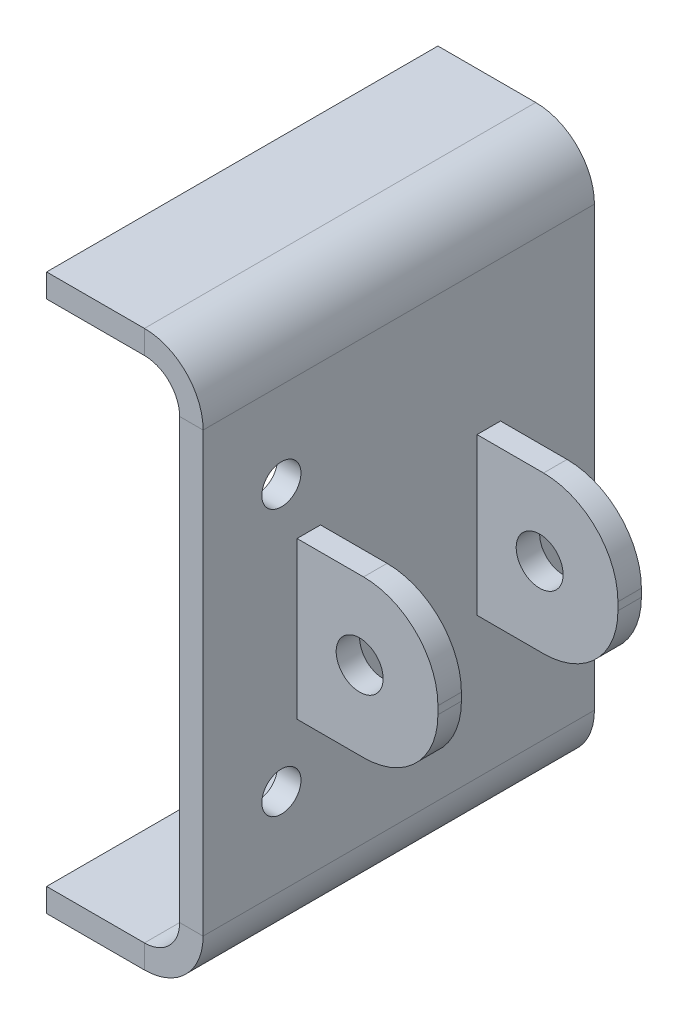
ISO-10303-21;
HEADER;
FILE_DESCRIPTION(('STEP AP214'),'2;1');
FILE_NAME('part.step','',(''),(''),'','','');
FILE_SCHEMA(('AUTOMOTIVE_DESIGN { 1 0 10303 214 1 1 1 1 }'));
ENDSEC;
DATA;
#1=APPLICATION_CONTEXT('core data for automotive mechanical design processes');
#2=APPLICATION_PROTOCOL_DEFINITION('international standard','automotive_design',2000,#1);
#3=PRODUCT_CONTEXT('',#1,'mechanical');
#4=PRODUCT('Part','Part','',(#3));
#5=PRODUCT_RELATED_PRODUCT_CATEGORY('part','',(#4));
#6=PRODUCT_DEFINITION_FORMATION('','',#4);
#7=PRODUCT_DEFINITION_CONTEXT('part definition',#1,'design');
#8=PRODUCT_DEFINITION('design','',#6,#7);
#9=PRODUCT_DEFINITION_SHAPE('','',#8);
#10=(LENGTH_UNIT() NAMED_UNIT(*) SI_UNIT(.MILLI.,.METRE.));
#11=(NAMED_UNIT(*) PLANE_ANGLE_UNIT() SI_UNIT($,.RADIAN.));
#12=(NAMED_UNIT(*) SI_UNIT($,.STERADIAN.) SOLID_ANGLE_UNIT());
#13=UNCERTAINTY_MEASURE_WITH_UNIT(LENGTH_MEASURE(1.E-05),#10,'distance_accuracy_value','');
#14=(GEOMETRIC_REPRESENTATION_CONTEXT(3) GLOBAL_UNCERTAINTY_ASSIGNED_CONTEXT((#13)) GLOBAL_UNIT_ASSIGNED_CONTEXT((#10,
#11,#12)) REPRESENTATION_CONTEXT('',''));
#15=CARTESIAN_POINT('',(0.,0.,0.));
#16=DIRECTION('',(0.,0.,1.));
#17=DIRECTION('',(1.,0.,0.));
#18=AXIS2_PLACEMENT_3D('',#15,#16,#17);
#19=CARTESIAN_POINT('',(3.,0.,0.));
#20=DIRECTION('',(-1.,0.,0.));
#21=DIRECTION('',(0.,0.,1.));
#22=AXIS2_PLACEMENT_3D('',#19,#20,#21);
#23=PLANE('',#22);
#24=DIRECTION('',(0.,0.,-1.));
#25=VECTOR('',#24,1.);
#26=CARTESIAN_POINT('',(3.,-10.,-10.));
#27=LINE('',#26,#25);
#28=CARTESIAN_POINT('',(3.,-10.,-10.));
#29=VERTEX_POINT('',#28);
#30=CARTESIAN_POINT('',(3.,-10.,-13.));
#31=VERTEX_POINT('',#30);
#32=EDGE_CURVE('E219',#29,#31,#27,.T.);
#33=ORIENTED_EDGE('',*,*,#32,.F.);
#34=DIRECTION('',(0.,-1.,0.));
#35=VECTOR('',#34,1.);
#36=CARTESIAN_POINT('',(3.,9.99999999999999,-10.));
#37=LINE('',#36,#35);
#38=CARTESIAN_POINT('',(3.,9.99999999999999,-10.));
#39=VERTEX_POINT('',#38);
#40=EDGE_CURVE('E246',#39,#29,#37,.T.);
#41=ORIENTED_EDGE('',*,*,#40,.F.);
#42=DIRECTION('',(0.,0.,1.));
#43=VECTOR('',#42,1.);
#44=CARTESIAN_POINT('',(3.,9.99999999999999,-10.));
#45=LINE('',#44,#43);
#46=CARTESIAN_POINT('',(3.,9.99999999999999,-13.));
#47=VERTEX_POINT('',#46);
#48=EDGE_CURVE('E249',#47,#39,#45,.T.);
#49=ORIENTED_EDGE('',*,*,#48,.F.);
#50=DIRECTION('',(0.,1.,0.));
#51=VECTOR('',#50,1.);
#52=CARTESIAN_POINT('',(3.,9.99999999999999,-13.));
#53=LINE('',#52,#51);
#54=EDGE_CURVE('E253',#31,#47,#53,.T.);
#55=ORIENTED_EDGE('',*,*,#54,.F.);
#56=EDGE_LOOP('',(#33,#41,#49,#55));
#57=FACE_BOUND('',#56,.T.);
#58=CARTESIAN_POINT('',(3.,-17.,15.));
#59=DIRECTION('',(1.,0.,0.));
#60=DIRECTION('',(0.,0.,-1.));
#61=AXIS2_PLACEMENT_3D('',#58,#59,#60);
#62=CIRCLE('',#61,2.5);
#63=CARTESIAN_POINT('',(3.,-17.,12.5));
#64=VERTEX_POINT('',#63);
#65=EDGE_CURVE('E262',#64,#64,#62,.T.);
#66=ORIENTED_EDGE('',*,*,#65,.F.);
#67=EDGE_LOOP('',(#66));
#68=FACE_BOUND('',#67,.T.);
#69=CARTESIAN_POINT('',(3.,17.,15.));
#70=DIRECTION('',(1.,0.,0.));
#71=DIRECTION('',(0.,0.,-1.));
#72=AXIS2_PLACEMENT_3D('',#69,#70,#71);
#73=CIRCLE('',#72,2.5);
#74=CARTESIAN_POINT('',(3.,17.,12.5));
#75=VERTEX_POINT('',#74);
#76=EDGE_CURVE('E235',#75,#75,#73,.T.);
#77=ORIENTED_EDGE('',*,*,#76,.F.);
#78=EDGE_LOOP('',(#77));
#79=FACE_BOUND('',#78,.T.);
#80=DIRECTION('',(0.,0.,1.));
#81=VECTOR('',#80,1.);
#82=CARTESIAN_POINT('',(3.,-28.,25.));
#83=LINE('',#82,#81);
#84=CARTESIAN_POINT('',(3.,-28.,25.));
#85=VERTEX_POINT('',#84);
#86=CARTESIAN_POINT('',(3.,-28.,-25.));
#87=VERTEX_POINT('',#86);
#88=EDGE_CURVE('E300',#85,#87,#83,.F.);
#89=ORIENTED_EDGE('',*,*,#88,.T.);
#90=DIRECTION('',(0.,1.,0.));
#91=VECTOR('',#90,1.);
#92=CARTESIAN_POINT('',(3.,-32.5,-25.));
#93=LINE('',#92,#91);
#94=CARTESIAN_POINT('',(3.,28.,-25.));
#95=VERTEX_POINT('',#94);
#96=EDGE_CURVE('E377',#87,#95,#93,.T.);
#97=ORIENTED_EDGE('',*,*,#96,.T.);
#98=DIRECTION('',(0.,0.,-1.));
#99=VECTOR('',#98,1.);
#100=CARTESIAN_POINT('',(3.,28.,-25.));
#101=LINE('',#100,#99);
#102=CARTESIAN_POINT('',(3.,28.,25.));
#103=VERTEX_POINT('',#102);
#104=EDGE_CURVE('E353',#95,#103,#101,.F.);
#105=ORIENTED_EDGE('',*,*,#104,.T.);
#106=DIRECTION('',(0.,-1.,0.));
#107=VECTOR('',#106,1.);
#108=CARTESIAN_POINT('',(3.,-32.5,25.));
#109=LINE('',#108,#107);
#110=EDGE_CURVE('E375',#103,#85,#109,.T.);
#111=ORIENTED_EDGE('',*,*,#110,.T.);
#112=EDGE_LOOP('',(#89,#97,#105,#111));
#113=FACE_BOUND('',#112,.T.);
#114=DIRECTION('',(0.,0.,-1.));
#115=VECTOR('',#114,1.);
#116=CARTESIAN_POINT('',(3.,-10.,13.));
#117=LINE('',#116,#115);
#118=CARTESIAN_POINT('',(3.,-10.,13.));
#119=VERTEX_POINT('',#118);
#120=CARTESIAN_POINT('',(3.,-10.,10.));
#121=VERTEX_POINT('',#120);
#122=EDGE_CURVE('E205',#119,#121,#117,.T.);
#123=ORIENTED_EDGE('',*,*,#122,.F.);
#124=DIRECTION('',(0.,-1.,0.));
#125=VECTOR('',#124,1.);
#126=CARTESIAN_POINT('',(3.,9.99999999999999,13.));
#127=LINE('',#126,#125);
#128=CARTESIAN_POINT('',(3.,9.99999999999999,13.));
#129=VERTEX_POINT('',#128);
#130=EDGE_CURVE('E215',#129,#119,#127,.T.);
#131=ORIENTED_EDGE('',*,*,#130,.F.);
#132=DIRECTION('',(0.,0.,1.));
#133=VECTOR('',#132,1.);
#134=CARTESIAN_POINT('',(3.,9.99999999999999,13.));
#135=LINE('',#134,#133);
#136=CARTESIAN_POINT('',(3.,9.99999999999999,10.));
#137=VERTEX_POINT('',#136);
#138=EDGE_CURVE('E223',#137,#129,#135,.T.);
#139=ORIENTED_EDGE('',*,*,#138,.F.);
#140=DIRECTION('',(0.,1.,0.));
#141=VECTOR('',#140,1.);
#142=CARTESIAN_POINT('',(3.,9.99999999999999,10.));
#143=LINE('',#142,#141);
#144=EDGE_CURVE('E218',#121,#137,#143,.T.);
#145=ORIENTED_EDGE('',*,*,#144,.F.);
#146=EDGE_LOOP('',(#123,#131,#139,#145));
#147=FACE_BOUND('',#146,.T.);
#148=ADVANCED_FACE('F43',(#57,#68,#79,#113,#147),#23,.F.);
#149=CARTESIAN_POINT('',(3.,-32.5,25.));
#150=DIRECTION('',(0.,0.,-1.));
#151=DIRECTION('',(-1.,0.,0.));
#152=AXIS2_PLACEMENT_3D('',#149,#150,#151);
#153=PLANE('',#152);
#154=DIRECTION('',(1.,0.,0.));
#155=VECTOR('',#154,1.);
#156=CARTESIAN_POINT('',(0.,-28.,25.));
#157=LINE('',#156,#155);
#158=CARTESIAN_POINT('',(0.,-28.,25.));
#159=VERTEX_POINT('',#158);
#160=EDGE_CURVE('E306',#159,#85,#157,.T.);
#161=ORIENTED_EDGE('',*,*,#160,.T.);
#162=ORIENTED_EDGE('',*,*,#110,.F.);
#163=DIRECTION('',(1.,0.,0.));
#164=VECTOR('',#163,1.);
#165=CARTESIAN_POINT('',(0.,28.,25.));
#166=LINE('',#165,#164);
#167=CARTESIAN_POINT('',(0.,28.,25.));
#168=VERTEX_POINT('',#167);
#169=EDGE_CURVE('E370',#168,#103,#166,.T.);
#170=ORIENTED_EDGE('',*,*,#169,.F.);
#171=DIRECTION('',(0.,-1.,0.));
#172=VECTOR('',#171,1.);
#173=CARTESIAN_POINT('',(0.,-32.5,25.));
#174=LINE('',#173,#172);
#175=EDGE_CURVE('E373',#168,#159,#174,.T.);
#176=ORIENTED_EDGE('',*,*,#175,.T.);
#177=EDGE_LOOP('',(#161,#162,#170,#176));
#178=FACE_BOUND('',#177,.T.);
#179=ADVANCED_FACE('F462',(#178),#153,.F.);
#180=CARTESIAN_POINT('',(3.,-32.5,-25.));
#181=DIRECTION('',(0.,0.,1.));
#182=DIRECTION('',(1.,0.,0.));
#183=AXIS2_PLACEMENT_3D('',#180,#181,#182);
#184=PLANE('',#183);
#185=DIRECTION('',(1.,0.,0.));
#186=VECTOR('',#185,1.);
#187=CARTESIAN_POINT('',(0.,-28.,-25.));
#188=LINE('',#187,#186);
#189=CARTESIAN_POINT('',(0.,-28.,-25.));
#190=VERTEX_POINT('',#189);
#191=EDGE_CURVE('E317',#190,#87,#188,.T.);
#192=ORIENTED_EDGE('',*,*,#191,.F.);
#193=DIRECTION('',(0.,1.,0.));
#194=VECTOR('',#193,1.);
#195=CARTESIAN_POINT('',(0.,-32.5,-25.));
#196=LINE('',#195,#194);
#197=CARTESIAN_POINT('',(0.,28.,-25.));
#198=VERTEX_POINT('',#197);
#199=EDGE_CURVE('E378',#190,#198,#196,.T.);
#200=ORIENTED_EDGE('',*,*,#199,.T.);
#201=DIRECTION('',(1.,0.,0.));
#202=VECTOR('',#201,1.);
#203=CARTESIAN_POINT('',(0.,28.,-25.));
#204=LINE('',#203,#202);
#205=EDGE_CURVE('E359',#198,#95,#204,.T.);
#206=ORIENTED_EDGE('',*,*,#205,.T.);
#207=ORIENTED_EDGE('',*,*,#96,.F.);
#208=EDGE_LOOP('',(#192,#200,#206,#207));
#209=FACE_BOUND('',#208,.T.);
#210=ADVANCED_FACE('F470',(#209),#184,.F.);
#211=CARTESIAN_POINT('',(0.,0.,0.));
#212=DIRECTION('',(-1.,0.,0.));
#213=DIRECTION('',(0.,0.,1.));
#214=AXIS2_PLACEMENT_3D('',#211,#212,#213);
#215=PLANE('',#214);
#216=CARTESIAN_POINT('',(0.,-17.,15.));
#217=DIRECTION('',(-1.,0.,0.));
#218=DIRECTION('',(0.,0.,1.));
#219=AXIS2_PLACEMENT_3D('',#216,#217,#218);
#220=CIRCLE('',#219,2.5);
#221=CARTESIAN_POINT('',(0.,-17.,17.5));
#222=VERTEX_POINT('',#221);
#223=EDGE_CURVE('E277',#222,#222,#220,.T.);
#224=ORIENTED_EDGE('',*,*,#223,.F.);
#225=EDGE_LOOP('',(#224));
#226=FACE_BOUND('',#225,.T.);
#227=CARTESIAN_POINT('',(0.,17.,15.));
#228=DIRECTION('',(-1.,0.,0.));
#229=DIRECTION('',(0.,0.,1.));
#230=AXIS2_PLACEMENT_3D('',#227,#228,#229);
#231=CIRCLE('',#230,2.5);
#232=CARTESIAN_POINT('',(0.,17.,17.5));
#233=VERTEX_POINT('',#232);
#234=EDGE_CURVE('E265',#233,#233,#231,.T.);
#235=ORIENTED_EDGE('',*,*,#234,.F.);
#236=EDGE_LOOP('',(#235));
#237=FACE_BOUND('',#236,.T.);
#238=ORIENTED_EDGE('',*,*,#199,.F.);
#239=DIRECTION('',(0.,0.,1.));
#240=VECTOR('',#239,1.);
#241=CARTESIAN_POINT('',(0.,-28.,25.));
#242=LINE('',#241,#240);
#243=EDGE_CURVE('E312',#159,#190,#242,.F.);
#244=ORIENTED_EDGE('',*,*,#243,.F.);
#245=ORIENTED_EDGE('',*,*,#175,.F.);
#246=DIRECTION('',(0.,0.,-1.));
#247=VECTOR('',#246,1.);
#248=CARTESIAN_POINT('',(0.,28.,-25.));
#249=LINE('',#248,#247);
#250=EDGE_CURVE('E365',#198,#168,#249,.F.);
#251=ORIENTED_EDGE('',*,*,#250,.F.);
#252=EDGE_LOOP('',(#238,#244,#245,#251));
#253=FACE_BOUND('',#252,.T.);
#254=ADVANCED_FACE('F479',(#226,#237,#253),#215,.T.);
#255=CARTESIAN_POINT('',(-4.5,28.,25.));
#256=DIRECTION('',(0.,0.,1.));
#257=DIRECTION('',(1.,0.,0.));
#258=AXIS2_PLACEMENT_3D('',#255,#256,#257);
#259=PLANE('',#258);
#260=DIRECTION('',(0.,1.,0.));
#261=VECTOR('',#260,1.);
#262=CARTESIAN_POINT('',(-4.49999999999998,32.5,25.));
#263=LINE('',#262,#261);
#264=CARTESIAN_POINT('',(-4.49999999999998,32.5,25.));
#265=VERTEX_POINT('',#264);
#266=CARTESIAN_POINT('',(-4.49999999999997,35.5,25.));
#267=VERTEX_POINT('',#266);
#268=EDGE_CURVE('E320',#265,#267,#263,.T.);
#269=ORIENTED_EDGE('',*,*,#268,.F.);
#270=CARTESIAN_POINT('',(-4.5,28.,25.));
#271=DIRECTION('',(0.,0.,-1.));
#272=DIRECTION('',(-1.,0.,0.));
#273=AXIS2_PLACEMENT_3D('',#270,#271,#272);
#274=CIRCLE('',#273,4.5);
#275=EDGE_CURVE('E362',#168,#265,#274,.F.);
#276=ORIENTED_EDGE('',*,*,#275,.F.);
#277=ORIENTED_EDGE('',*,*,#169,.T.);
#278=CARTESIAN_POINT('',(-4.5,28.,25.));
#279=DIRECTION('',(0.,0.,-1.));
#280=DIRECTION('',(-1.,0.,0.));
#281=AXIS2_PLACEMENT_3D('',#278,#279,#280);
#282=CIRCLE('',#281,7.5);
#283=EDGE_CURVE('E355',#103,#267,#282,.F.);
#284=ORIENTED_EDGE('',*,*,#283,.T.);
#285=EDGE_LOOP('',(#269,#276,#277,#284));
#286=FACE_BOUND('',#285,.T.);
#287=ADVANCED_FACE('F482',(#286),#259,.T.);
#288=CARTESIAN_POINT('',(-4.5,28.,-25.));
#289=DIRECTION('',(0.,0.,1.));
#290=DIRECTION('',(1.,0.,0.));
#291=AXIS2_PLACEMENT_3D('',#288,#289,#290);
#292=PLANE('',#291);
#293=CARTESIAN_POINT('',(-4.5,28.,-25.));
#294=DIRECTION('',(0.,0.,-1.));
#295=DIRECTION('',(-1.,0.,0.));
#296=AXIS2_PLACEMENT_3D('',#293,#294,#295);
#297=CIRCLE('',#296,4.5);
#298=CARTESIAN_POINT('',(-4.49999999999998,32.5,-25.));
#299=VERTEX_POINT('',#298);
#300=EDGE_CURVE('E352',#299,#198,#297,.T.);
#301=ORIENTED_EDGE('',*,*,#300,.F.);
#302=DIRECTION('',(0.,1.,0.));
#303=VECTOR('',#302,1.);
#304=CARTESIAN_POINT('',(-4.49999999999998,32.5,-25.));
#305=LINE('',#304,#303);
#306=CARTESIAN_POINT('',(-4.49999999999997,35.5,-25.));
#307=VERTEX_POINT('',#306);
#308=EDGE_CURVE('E325',#299,#307,#305,.T.);
#309=ORIENTED_EDGE('',*,*,#308,.T.);
#310=CARTESIAN_POINT('',(-4.5,28.,-25.));
#311=DIRECTION('',(0.,0.,-1.));
#312=DIRECTION('',(-1.,0.,0.));
#313=AXIS2_PLACEMENT_3D('',#310,#311,#312);
#314=CIRCLE('',#313,7.5);
#315=EDGE_CURVE('E356',#307,#95,#314,.T.);
#316=ORIENTED_EDGE('',*,*,#315,.T.);
#317=ORIENTED_EDGE('',*,*,#205,.F.);
#318=EDGE_LOOP('',(#301,#309,#316,#317));
#319=FACE_BOUND('',#318,.T.);
#320=ADVANCED_FACE('F477',(#319),#292,.F.);
#321=CARTESIAN_POINT('',(-4.5,28.,-25.));
#322=DIRECTION('',(0.,0.,-1.));
#323=DIRECTION('',(0.,1.,0.));
#324=AXIS2_PLACEMENT_3D('',#321,#322,#323);
#325=CYLINDRICAL_SURFACE('',#324,7.5);
#326=ORIENTED_EDGE('',*,*,#104,.F.);
#327=ORIENTED_EDGE('',*,*,#315,.F.);
#328=DIRECTION('',(0.,0.,1.));
#329=VECTOR('',#328,1.);
#330=CARTESIAN_POINT('',(-4.49999999999997,35.5,0.));
#331=LINE('',#330,#329);
#332=EDGE_CURVE('E328',#307,#267,#331,.T.);
#333=ORIENTED_EDGE('',*,*,#332,.T.);
#334=ORIENTED_EDGE('',*,*,#283,.F.);
#335=EDGE_LOOP('',(#326,#327,#333,#334));
#336=FACE_BOUND('',#335,.T.);
#337=ADVANCED_FACE('F613',(#336),#325,.T.);
#338=CARTESIAN_POINT('',(-4.5,28.,-25.));
#339=DIRECTION('',(0.,0.,-1.));
#340=DIRECTION('',(0.,1.,0.));
#341=AXIS2_PLACEMENT_3D('',#338,#339,#340);
#342=CYLINDRICAL_SURFACE('',#341,4.5);
#343=ORIENTED_EDGE('',*,*,#250,.T.);
#344=ORIENTED_EDGE('',*,*,#275,.T.);
#345=DIRECTION('',(0.,0.,-1.));
#346=VECTOR('',#345,1.);
#347=CARTESIAN_POINT('',(-4.49999999999998,32.5,25.));
#348=LINE('',#347,#346);
#349=EDGE_CURVE('E323',#265,#299,#348,.T.);
#350=ORIENTED_EDGE('',*,*,#349,.T.);
#351=ORIENTED_EDGE('',*,*,#300,.T.);
#352=EDGE_LOOP('',(#343,#344,#350,#351));
#353=FACE_BOUND('',#352,.T.);
#354=ADVANCED_FACE('F611',(#353),#342,.F.);
#355=CARTESIAN_POINT('',(-17.,35.5000000000001,-25.));
#356=DIRECTION('',(0.,0.,1.));
#357=DIRECTION('',(1.,0.,0.));
#358=AXIS2_PLACEMENT_3D('',#355,#356,#357);
#359=PLANE('',#358);
#360=ORIENTED_EDGE('',*,*,#308,.F.);
#361=DIRECTION('',(-1.,0.,0.));
#362=VECTOR('',#361,1.);
#363=CARTESIAN_POINT('',(-17.,32.5000000000001,-25.));
#364=LINE('',#363,#362);
#365=CARTESIAN_POINT('',(-17.,32.5000000000001,-25.));
#366=VERTEX_POINT('',#365);
#367=EDGE_CURVE('E332',#299,#366,#364,.T.);
#368=ORIENTED_EDGE('',*,*,#367,.T.);
#369=DIRECTION('',(0.,-1.,0.));
#370=VECTOR('',#369,1.);
#371=CARTESIAN_POINT('',(-17.,35.5000000000001,-25.));
#372=LINE('',#371,#370);
#373=CARTESIAN_POINT('',(-17.,35.5000000000001,-25.));
#374=VERTEX_POINT('',#373);
#375=EDGE_CURVE('E349',#374,#366,#372,.T.);
#376=ORIENTED_EDGE('',*,*,#375,.F.);
#377=DIRECTION('',(-1.,0.,0.));
#378=VECTOR('',#377,1.);
#379=CARTESIAN_POINT('',(-17.,35.5000000000001,-25.));
#380=LINE('',#379,#378);
#381=EDGE_CURVE('E333',#307,#374,#380,.T.);
#382=ORIENTED_EDGE('',*,*,#381,.F.);
#383=EDGE_LOOP('',(#360,#368,#376,#382));
#384=FACE_BOUND('',#383,.T.);
#385=ADVANCED_FACE('F604',(#384),#359,.F.);
#386=CARTESIAN_POINT('',(0.,35.5,25.));
#387=DIRECTION('',(0.,0.,-1.));
#388=DIRECTION('',(-1.,0.,0.));
#389=AXIS2_PLACEMENT_3D('',#386,#387,#388);
#390=PLANE('',#389);
#391=ORIENTED_EDGE('',*,*,#268,.T.);
#392=DIRECTION('',(1.,0.,0.));
#393=VECTOR('',#392,1.);
#394=CARTESIAN_POINT('',(0.,35.5,25.));
#395=LINE('',#394,#393);
#396=CARTESIAN_POINT('',(-17.,35.5000000000001,25.));
#397=VERTEX_POINT('',#396);
#398=EDGE_CURVE('E338',#397,#267,#395,.T.);
#399=ORIENTED_EDGE('',*,*,#398,.F.);
#400=DIRECTION('',(0.,-1.,0.));
#401=VECTOR('',#400,1.);
#402=CARTESIAN_POINT('',(-17.,35.5000000000001,25.));
#403=LINE('',#402,#401);
#404=CARTESIAN_POINT('',(-17.,32.5000000000001,25.));
#405=VERTEX_POINT('',#404);
#406=EDGE_CURVE('E341',#397,#405,#403,.T.);
#407=ORIENTED_EDGE('',*,*,#406,.T.);
#408=DIRECTION('',(1.,0.,0.));
#409=VECTOR('',#408,1.);
#410=CARTESIAN_POINT('',(0.,32.5,25.));
#411=LINE('',#410,#409);
#412=EDGE_CURVE('E336',#405,#265,#411,.T.);
#413=ORIENTED_EDGE('',*,*,#412,.T.);
#414=EDGE_LOOP('',(#391,#399,#407,#413));
#415=FACE_BOUND('',#414,.T.);
#416=ADVANCED_FACE('F597',(#415),#390,.F.);
#417=CARTESIAN_POINT('',(1.29864236186698E-13,35.5,0.));
#418=DIRECTION('',(0.,-1.,0.));
#419=DIRECTION('',(1.,0.,0.));
#420=AXIS2_PLACEMENT_3D('',#417,#418,#419);
#421=PLANE('',#420);
#422=ORIENTED_EDGE('',*,*,#332,.F.);
#423=ORIENTED_EDGE('',*,*,#381,.T.);
#424=DIRECTION('',(0.,0.,1.));
#425=VECTOR('',#424,1.);
#426=CARTESIAN_POINT('',(-17.,35.5000000000001,25.));
#427=LINE('',#426,#425);
#428=EDGE_CURVE('E335',#374,#397,#427,.T.);
#429=ORIENTED_EDGE('',*,*,#428,.T.);
#430=ORIENTED_EDGE('',*,*,#398,.T.);
#431=EDGE_LOOP('',(#422,#423,#429,#430));
#432=FACE_BOUND('',#431,.T.);
#433=ADVANCED_FACE('F593',(#432),#421,.F.);
#434=CARTESIAN_POINT('',(1.19389792170168E-13,32.5,0.));
#435=DIRECTION('',(0.,-1.,0.));
#436=DIRECTION('',(1.,0.,0.));
#437=AXIS2_PLACEMENT_3D('',#434,#435,#436);
#438=PLANE('',#437);
#439=ORIENTED_EDGE('',*,*,#367,.F.);
#440=ORIENTED_EDGE('',*,*,#349,.F.);
#441=ORIENTED_EDGE('',*,*,#412,.F.);
#442=DIRECTION('',(0.,0.,1.));
#443=VECTOR('',#442,1.);
#444=CARTESIAN_POINT('',(-17.,32.5000000000001,25.));
#445=LINE('',#444,#443);
#446=EDGE_CURVE('E343',#366,#405,#445,.T.);
#447=ORIENTED_EDGE('',*,*,#446,.F.);
#448=EDGE_LOOP('',(#439,#440,#441,#447));
#449=FACE_BOUND('',#448,.T.);
#450=ADVANCED_FACE('F596',(#449),#438,.T.);
#451=CARTESIAN_POINT('',(-17.,35.5000000000001,25.));
#452=DIRECTION('',(1.,0.,0.));
#453=DIRECTION('',(0.,1.,0.));
#454=AXIS2_PLACEMENT_3D('',#451,#452,#453);
#455=PLANE('',#454);
#456=ORIENTED_EDGE('',*,*,#446,.T.);
#457=ORIENTED_EDGE('',*,*,#406,.F.);
#458=ORIENTED_EDGE('',*,*,#428,.F.);
#459=ORIENTED_EDGE('',*,*,#375,.T.);
#460=EDGE_LOOP('',(#456,#457,#458,#459));
#461=FACE_BOUND('',#460,.T.);
#462=ADVANCED_FACE('F588',(#461),#455,.F.);
#463=CARTESIAN_POINT('',(-4.5,-28.,-25.));
#464=DIRECTION('',(0.,0.,-1.));
#465=DIRECTION('',(-1.,0.,0.));
#466=AXIS2_PLACEMENT_3D('',#463,#464,#465);
#467=PLANE('',#466);
#468=DIRECTION('',(0.,-1.,0.));
#469=VECTOR('',#468,1.);
#470=CARTESIAN_POINT('',(-4.49999999999998,-32.5,-25.));
#471=LINE('',#470,#469);
#472=CARTESIAN_POINT('',(-4.49999999999998,-32.5,-25.));
#473=VERTEX_POINT('',#472);
#474=CARTESIAN_POINT('',(-4.49999999999997,-35.5,-25.));
#475=VERTEX_POINT('',#474);
#476=EDGE_CURVE('E271',#473,#475,#471,.T.);
#477=ORIENTED_EDGE('',*,*,#476,.F.);
#478=CARTESIAN_POINT('',(-4.5,-28.,-25.));
#479=DIRECTION('',(0.,0.,1.));
#480=DIRECTION('',(1.,0.,0.));
#481=AXIS2_PLACEMENT_3D('',#478,#479,#480);
#482=CIRCLE('',#481,4.5);
#483=EDGE_CURVE('E309',#190,#473,#482,.F.);
#484=ORIENTED_EDGE('',*,*,#483,.F.);
#485=ORIENTED_EDGE('',*,*,#191,.T.);
#486=CARTESIAN_POINT('',(-4.5,-28.,-25.));
#487=DIRECTION('',(0.,0.,1.));
#488=DIRECTION('',(1.,0.,0.));
#489=AXIS2_PLACEMENT_3D('',#486,#487,#488);
#490=CIRCLE('',#489,7.5);
#491=EDGE_CURVE('E302',#87,#475,#490,.F.);
#492=ORIENTED_EDGE('',*,*,#491,.T.);
#493=EDGE_LOOP('',(#477,#484,#485,#492));
#494=FACE_BOUND('',#493,.T.);
#495=ADVANCED_FACE('F585',(#494),#467,.T.);
#496=CARTESIAN_POINT('',(-4.5,-28.,25.));
#497=DIRECTION('',(0.,0.,-1.));
#498=DIRECTION('',(-1.,0.,0.));
#499=AXIS2_PLACEMENT_3D('',#496,#497,#498);
#500=PLANE('',#499);
#501=CARTESIAN_POINT('',(-4.5,-28.,25.));
#502=DIRECTION('',(0.,0.,1.));
#503=DIRECTION('',(1.,0.,0.));
#504=AXIS2_PLACEMENT_3D('',#501,#502,#503);
#505=CIRCLE('',#504,4.5);
#506=CARTESIAN_POINT('',(-4.49999999999998,-32.5,25.));
#507=VERTEX_POINT('',#506);
#508=EDGE_CURVE('E299',#507,#159,#505,.T.);
#509=ORIENTED_EDGE('',*,*,#508,.F.);
#510=DIRECTION('',(0.,-1.,0.));
#511=VECTOR('',#510,1.);
#512=CARTESIAN_POINT('',(-4.49999999999998,-32.5,25.));
#513=LINE('',#512,#511);
#514=CARTESIAN_POINT('',(-4.49999999999997,-35.5,25.));
#515=VERTEX_POINT('',#514);
#516=EDGE_CURVE('E270',#507,#515,#513,.T.);
#517=ORIENTED_EDGE('',*,*,#516,.T.);
#518=CARTESIAN_POINT('',(-4.5,-28.,25.));
#519=DIRECTION('',(0.,0.,1.));
#520=DIRECTION('',(1.,0.,0.));
#521=AXIS2_PLACEMENT_3D('',#518,#519,#520);
#522=CIRCLE('',#521,7.5);
#523=EDGE_CURVE('E303',#515,#85,#522,.T.);
#524=ORIENTED_EDGE('',*,*,#523,.T.);
#525=ORIENTED_EDGE('',*,*,#160,.F.);
#526=EDGE_LOOP('',(#509,#517,#524,#525));
#527=FACE_BOUND('',#526,.T.);
#528=ADVANCED_FACE('F580',(#527),#500,.F.);
#529=CARTESIAN_POINT('',(-4.5,-28.,25.));
#530=DIRECTION('',(0.,0.,1.));
#531=DIRECTION('',(0.,-1.,0.));
#532=AXIS2_PLACEMENT_3D('',#529,#530,#531);
#533=CYLINDRICAL_SURFACE('',#532,7.5);
#534=ORIENTED_EDGE('',*,*,#88,.F.);
#535=ORIENTED_EDGE('',*,*,#523,.F.);
#536=DIRECTION('',(0.,0.,-1.));
#537=VECTOR('',#536,1.);
#538=CARTESIAN_POINT('',(-4.49999999999997,-35.5,0.));
#539=LINE('',#538,#537);
#540=EDGE_CURVE('E274',#515,#475,#539,.T.);
#541=ORIENTED_EDGE('',*,*,#540,.T.);
#542=ORIENTED_EDGE('',*,*,#491,.F.);
#543=EDGE_LOOP('',(#534,#535,#541,#542));
#544=FACE_BOUND('',#543,.T.);
#545=ADVANCED_FACE('F577',(#544),#533,.T.);
#546=CARTESIAN_POINT('',(-4.5,-28.,25.));
#547=DIRECTION('',(0.,0.,1.));
#548=DIRECTION('',(0.,-1.,0.));
#549=AXIS2_PLACEMENT_3D('',#546,#547,#548);
#550=CYLINDRICAL_SURFACE('',#549,4.5);
#551=ORIENTED_EDGE('',*,*,#243,.T.);
#552=ORIENTED_EDGE('',*,*,#483,.T.);
#553=DIRECTION('',(0.,0.,1.));
#554=VECTOR('',#553,1.);
#555=CARTESIAN_POINT('',(-4.49999999999998,-32.5,-25.));
#556=LINE('',#555,#554);
#557=EDGE_CURVE('E268',#473,#507,#556,.T.);
#558=ORIENTED_EDGE('',*,*,#557,.T.);
#559=ORIENTED_EDGE('',*,*,#508,.T.);
#560=EDGE_LOOP('',(#551,#552,#558,#559));
#561=FACE_BOUND('',#560,.T.);
#562=ADVANCED_FACE('F575',(#561),#550,.F.);
#563=CARTESIAN_POINT('',(-17.,-35.5000000000001,25.));
#564=DIRECTION('',(0.,0.,-1.));
#565=DIRECTION('',(-1.,0.,0.));
#566=AXIS2_PLACEMENT_3D('',#563,#564,#565);
#567=PLANE('',#566);
#568=ORIENTED_EDGE('',*,*,#516,.F.);
#569=DIRECTION('',(-1.,0.,0.));
#570=VECTOR('',#569,1.);
#571=CARTESIAN_POINT('',(-17.,-32.5000000000001,25.));
#572=LINE('',#571,#570);
#573=CARTESIAN_POINT('',(-17.,-32.5000000000001,25.));
#574=VERTEX_POINT('',#573);
#575=EDGE_CURVE('E279',#507,#574,#572,.T.);
#576=ORIENTED_EDGE('',*,*,#575,.T.);
#577=DIRECTION('',(0.,1.,0.));
#578=VECTOR('',#577,1.);
#579=CARTESIAN_POINT('',(-17.,-35.5000000000001,25.));
#580=LINE('',#579,#578);
#581=CARTESIAN_POINT('',(-17.,-35.5000000000001,25.));
#582=VERTEX_POINT('',#581);
#583=EDGE_CURVE('E296',#582,#574,#580,.T.);
#584=ORIENTED_EDGE('',*,*,#583,.F.);
#585=DIRECTION('',(-1.,0.,0.));
#586=VECTOR('',#585,1.);
#587=CARTESIAN_POINT('',(-17.,-35.5000000000001,25.));
#588=LINE('',#587,#586);
#589=EDGE_CURVE('E280',#515,#582,#588,.T.);
#590=ORIENTED_EDGE('',*,*,#589,.F.);
#591=EDGE_LOOP('',(#568,#576,#584,#590));
#592=FACE_BOUND('',#591,.T.);
#593=ADVANCED_FACE('F568',(#592),#567,.F.);
#594=CARTESIAN_POINT('',(0.,-35.5,-25.));
#595=DIRECTION('',(0.,0.,1.));
#596=DIRECTION('',(1.,0.,0.));
#597=AXIS2_PLACEMENT_3D('',#594,#595,#596);
#598=PLANE('',#597);
#599=ORIENTED_EDGE('',*,*,#476,.T.);
#600=DIRECTION('',(1.,0.,0.));
#601=VECTOR('',#600,1.);
#602=CARTESIAN_POINT('',(0.,-35.5,-25.));
#603=LINE('',#602,#601);
#604=CARTESIAN_POINT('',(-17.,-35.5000000000001,-25.));
#605=VERTEX_POINT('',#604);
#606=EDGE_CURVE('E285',#605,#475,#603,.T.);
#607=ORIENTED_EDGE('',*,*,#606,.F.);
#608=DIRECTION('',(0.,1.,0.));
#609=VECTOR('',#608,1.);
#610=CARTESIAN_POINT('',(-17.,-35.5000000000001,-25.));
#611=LINE('',#610,#609);
#612=CARTESIAN_POINT('',(-17.,-32.5000000000001,-25.));
#613=VERTEX_POINT('',#612);
#614=EDGE_CURVE('E288',#605,#613,#611,.T.);
#615=ORIENTED_EDGE('',*,*,#614,.T.);
#616=DIRECTION('',(1.,0.,0.));
#617=VECTOR('',#616,1.);
#618=CARTESIAN_POINT('',(0.,-32.5,-25.));
#619=LINE('',#618,#617);
#620=EDGE_CURVE('E283',#613,#473,#619,.T.);
#621=ORIENTED_EDGE('',*,*,#620,.T.);
#622=EDGE_LOOP('',(#599,#607,#615,#621));
#623=FACE_BOUND('',#622,.T.);
#624=ADVANCED_FACE('F561',(#623),#598,.F.);
#625=CARTESIAN_POINT('',(1.29864236186698E-13,-35.5,0.));
#626=DIRECTION('',(0.,1.,0.));
#627=DIRECTION('',(-1.,0.,0.));
#628=AXIS2_PLACEMENT_3D('',#625,#626,#627);
#629=PLANE('',#628);
#630=ORIENTED_EDGE('',*,*,#540,.F.);
#631=ORIENTED_EDGE('',*,*,#589,.T.);
#632=DIRECTION('',(0.,0.,-1.));
#633=VECTOR('',#632,1.);
#634=CARTESIAN_POINT('',(-17.,-35.5000000000001,-25.));
#635=LINE('',#634,#633);
#636=EDGE_CURVE('E282',#582,#605,#635,.T.);
#637=ORIENTED_EDGE('',*,*,#636,.T.);
#638=ORIENTED_EDGE('',*,*,#606,.T.);
#639=EDGE_LOOP('',(#630,#631,#637,#638));
#640=FACE_BOUND('',#639,.T.);
#641=ADVANCED_FACE('F557',(#640),#629,.F.);
#642=CARTESIAN_POINT('',(1.19389792170168E-13,-32.5,0.));
#643=DIRECTION('',(0.,1.,0.));
#644=DIRECTION('',(-1.,0.,0.));
#645=AXIS2_PLACEMENT_3D('',#642,#643,#644);
#646=PLANE('',#645);
#647=ORIENTED_EDGE('',*,*,#575,.F.);
#648=ORIENTED_EDGE('',*,*,#557,.F.);
#649=ORIENTED_EDGE('',*,*,#620,.F.);
#650=DIRECTION('',(0.,0.,-1.));
#651=VECTOR('',#650,1.);
#652=CARTESIAN_POINT('',(-17.,-32.5000000000001,-25.));
#653=LINE('',#652,#651);
#654=EDGE_CURVE('E290',#574,#613,#653,.T.);
#655=ORIENTED_EDGE('',*,*,#654,.F.);
#656=EDGE_LOOP('',(#647,#648,#649,#655));
#657=FACE_BOUND('',#656,.T.);
#658=ADVANCED_FACE('F560',(#657),#646,.T.);
#659=CARTESIAN_POINT('',(-17.,-35.5000000000001,-25.));
#660=DIRECTION('',(1.,0.,0.));
#661=DIRECTION('',(0.,1.,0.));
#662=AXIS2_PLACEMENT_3D('',#659,#660,#661);
#663=PLANE('',#662);
#664=ORIENTED_EDGE('',*,*,#654,.T.);
#665=ORIENTED_EDGE('',*,*,#614,.F.);
#666=ORIENTED_EDGE('',*,*,#636,.F.);
#667=ORIENTED_EDGE('',*,*,#583,.T.);
#668=EDGE_LOOP('',(#664,#665,#666,#667));
#669=FACE_BOUND('',#668,.T.);
#670=ADVANCED_FACE('F555',(#669),#663,.F.);
#671=CARTESIAN_POINT('',(-7.,17.,15.));
#672=DIRECTION('',(1.,0.,0.));
#673=DIRECTION('',(0.,0.,-1.));
#674=AXIS2_PLACEMENT_3D('',#671,#672,#673);
#675=CYLINDRICAL_SURFACE('',#674,2.5);
#676=ORIENTED_EDGE('',*,*,#234,.T.);
#677=EDGE_LOOP('',(#676));
#678=FACE_BOUND('',#677,.T.);
#679=ORIENTED_EDGE('',*,*,#76,.T.);
#680=EDGE_LOOP('',(#679));
#681=FACE_BOUND('',#680,.T.);
#682=ADVANCED_FACE('F551',(#678,#681),#675,.F.);
#683=CARTESIAN_POINT('',(-7.,-17.,15.));
#684=DIRECTION('',(1.,0.,0.));
#685=DIRECTION('',(0.,0.,-1.));
#686=AXIS2_PLACEMENT_3D('',#683,#684,#685);
#687=CYLINDRICAL_SURFACE('',#686,2.5);
#688=ORIENTED_EDGE('',*,*,#223,.T.);
#689=EDGE_LOOP('',(#688));
#690=FACE_BOUND('',#689,.T.);
#691=ORIENTED_EDGE('',*,*,#65,.T.);
#692=EDGE_LOOP('',(#691));
#693=FACE_BOUND('',#692,.T.);
#694=ADVANCED_FACE('F549',(#690,#693),#687,.F.);
#695=CARTESIAN_POINT('',(21.,-10.,-10.));
#696=DIRECTION('',(0.,1.,0.));
#697=DIRECTION('',(0.,0.,1.));
#698=AXIS2_PLACEMENT_3D('',#695,#696,#697);
#699=PLANE('',#698);
#700=DIRECTION('',(-1.,0.,0.));
#701=VECTOR('',#700,1.);
#702=CARTESIAN_POINT('',(21.,-10.,-13.));
#703=LINE('',#702,#701);
#704=CARTESIAN_POINT('',(11.5,-10.,-13.));
#705=VERTEX_POINT('',#704);
#706=EDGE_CURVE('E236',#705,#31,#703,.T.);
#707=ORIENTED_EDGE('',*,*,#706,.F.);
#708=DIRECTION('',(0.,0.,-1.));
#709=VECTOR('',#708,1.);
#710=CARTESIAN_POINT('',(11.5,-10.,-10.));
#711=LINE('',#710,#709);
#712=CARTESIAN_POINT('',(11.5,-10.,-10.));
#713=VERTEX_POINT('',#712);
#714=EDGE_CURVE('E404',#705,#713,#711,.F.);
#715=ORIENTED_EDGE('',*,*,#714,.T.);
#716=DIRECTION('',(-1.,0.,0.));
#717=VECTOR('',#716,1.);
#718=CARTESIAN_POINT('',(21.,-10.,-10.));
#719=LINE('',#718,#717);
#720=EDGE_CURVE('E243',#713,#29,#719,.T.);
#721=ORIENTED_EDGE('',*,*,#720,.T.);
#722=ORIENTED_EDGE('',*,*,#32,.T.);
#723=EDGE_LOOP('',(#707,#715,#721,#722));
#724=FACE_BOUND('',#723,.T.);
#725=ADVANCED_FACE('F515',(#724),#699,.F.);
#726=CARTESIAN_POINT('',(21.,9.99999999999999,-13.));
#727=DIRECTION('',(0.,0.,1.));
#728=DIRECTION('',(0.,-1.,0.));
#729=AXIS2_PLACEMENT_3D('',#726,#727,#728);
#730=PLANE('',#729);
#731=CARTESIAN_POINT('',(11.,0.,-13.));
#732=DIRECTION('',(0.,0.,1.));
#733=DIRECTION('',(0.,-1.,0.));
#734=AXIS2_PLACEMENT_3D('',#731,#732,#733);
#735=CIRCLE('',#734,3.);
#736=CARTESIAN_POINT('',(11.,-3.,-13.));
#737=VERTEX_POINT('',#736);
#738=EDGE_CURVE('E239',#737,#737,#735,.T.);
#739=ORIENTED_EDGE('',*,*,#738,.T.);
#740=EDGE_LOOP('',(#739));
#741=FACE_BOUND('',#740,.T.);
#742=DIRECTION('',(-1.,0.,0.));
#743=VECTOR('',#742,1.);
#744=CARTESIAN_POINT('',(21.,9.99999999999999,-13.));
#745=LINE('',#744,#743);
#746=CARTESIAN_POINT('',(11.5,9.99999999999999,-13.));
#747=VERTEX_POINT('',#746);
#748=EDGE_CURVE('E238',#747,#47,#745,.T.);
#749=ORIENTED_EDGE('',*,*,#748,.F.);
#750=CARTESIAN_POINT('',(11.5,0.499999999999995,-13.));
#751=DIRECTION('',(0.,0.,1.));
#752=DIRECTION('',(0.,-1.,0.));
#753=AXIS2_PLACEMENT_3D('',#750,#751,#752);
#754=CIRCLE('',#753,9.5);
#755=CARTESIAN_POINT('',(21.,0.499999999999995,-13.));
#756=VERTEX_POINT('',#755);
#757=EDGE_CURVE('E402',#747,#756,#754,.F.);
#758=ORIENTED_EDGE('',*,*,#757,.T.);
#759=DIRECTION('',(0.,1.,0.));
#760=VECTOR('',#759,1.);
#761=CARTESIAN_POINT('',(21.,9.99999999999999,-13.));
#762=LINE('',#761,#760);
#763=CARTESIAN_POINT('',(21.,-0.500000000000006,-13.));
#764=VERTEX_POINT('',#763);
#765=EDGE_CURVE('E250',#764,#756,#762,.T.);
#766=ORIENTED_EDGE('',*,*,#765,.F.);
#767=CARTESIAN_POINT('',(11.5,-0.500000000000006,-13.));
#768=DIRECTION('',(0.,0.,1.));
#769=DIRECTION('',(0.,-1.,0.));
#770=AXIS2_PLACEMENT_3D('',#767,#768,#769);
#771=CIRCLE('',#770,9.5);
#772=EDGE_CURVE('E400',#764,#705,#771,.F.);
#773=ORIENTED_EDGE('',*,*,#772,.T.);
#774=ORIENTED_EDGE('',*,*,#706,.T.);
#775=ORIENTED_EDGE('',*,*,#54,.T.);
#776=EDGE_LOOP('',(#749,#758,#766,#773,#774,#775));
#777=FACE_BOUND('',#776,.T.);
#778=ADVANCED_FACE('F512',(#741,#777),#730,.F.);
#779=CARTESIAN_POINT('',(21.,9.99999999999999,-10.));
#780=DIRECTION('',(0.,-1.,0.));
#781=DIRECTION('',(0.,0.,-1.));
#782=AXIS2_PLACEMENT_3D('',#779,#780,#781);
#783=PLANE('',#782);
#784=DIRECTION('',(-1.,0.,0.));
#785=VECTOR('',#784,1.);
#786=CARTESIAN_POINT('',(21.,9.99999999999999,-10.));
#787=LINE('',#786,#785);
#788=CARTESIAN_POINT('',(11.5,9.99999999999999,-10.));
#789=VERTEX_POINT('',#788);
#790=EDGE_CURVE('E241',#789,#39,#787,.T.);
#791=ORIENTED_EDGE('',*,*,#790,.F.);
#792=DIRECTION('',(0.,0.,1.));
#793=VECTOR('',#792,1.);
#794=CARTESIAN_POINT('',(11.5,9.99999999999999,-10.));
#795=LINE('',#794,#793);
#796=EDGE_CURVE('E398',#789,#747,#795,.F.);
#797=ORIENTED_EDGE('',*,*,#796,.T.);
#798=ORIENTED_EDGE('',*,*,#748,.T.);
#799=ORIENTED_EDGE('',*,*,#48,.T.);
#800=EDGE_LOOP('',(#791,#797,#798,#799));
#801=FACE_BOUND('',#800,.T.);
#802=ADVANCED_FACE('F514',(#801),#783,.F.);
#803=CARTESIAN_POINT('',(21.,9.99999999999999,-10.));
#804=DIRECTION('',(0.,0.,-1.));
#805=DIRECTION('',(0.,1.,0.));
#806=AXIS2_PLACEMENT_3D('',#803,#804,#805);
#807=PLANE('',#806);
#808=CARTESIAN_POINT('',(11.,0.,-10.));
#809=DIRECTION('',(0.,0.,-1.));
#810=DIRECTION('',(0.,1.,0.));
#811=AXIS2_PLACEMENT_3D('',#808,#809,#810);
#812=CIRCLE('',#811,3.);
#813=CARTESIAN_POINT('',(11.,3.,-10.));
#814=VERTEX_POINT('',#813);
#815=EDGE_CURVE('E437',#814,#814,#812,.T.);
#816=ORIENTED_EDGE('',*,*,#815,.T.);
#817=EDGE_LOOP('',(#816));
#818=FACE_BOUND('',#817,.T.);
#819=DIRECTION('',(0.,-1.,0.));
#820=VECTOR('',#819,1.);
#821=CARTESIAN_POINT('',(21.,9.99999999999999,-10.));
#822=LINE('',#821,#820);
#823=CARTESIAN_POINT('',(21.,0.499999999999995,-10.));
#824=VERTEX_POINT('',#823);
#825=CARTESIAN_POINT('',(21.,-0.500000000000006,-10.));
#826=VERTEX_POINT('',#825);
#827=EDGE_CURVE('E245',#824,#826,#822,.T.);
#828=ORIENTED_EDGE('',*,*,#827,.F.);
#829=CARTESIAN_POINT('',(11.5,0.499999999999995,-10.));
#830=DIRECTION('',(0.,0.,-1.));
#831=DIRECTION('',(0.,1.,0.));
#832=AXIS2_PLACEMENT_3D('',#829,#830,#831);
#833=CIRCLE('',#832,9.5);
#834=EDGE_CURVE('E396',#824,#789,#833,.F.);
#835=ORIENTED_EDGE('',*,*,#834,.T.);
#836=ORIENTED_EDGE('',*,*,#790,.T.);
#837=ORIENTED_EDGE('',*,*,#40,.T.);
#838=ORIENTED_EDGE('',*,*,#720,.F.);
#839=CARTESIAN_POINT('',(11.5,-0.500000000000006,-10.));
#840=DIRECTION('',(0.,0.,-1.));
#841=DIRECTION('',(0.,1.,0.));
#842=AXIS2_PLACEMENT_3D('',#839,#840,#841);
#843=CIRCLE('',#842,9.5);
#844=EDGE_CURVE('E394',#713,#826,#843,.F.);
#845=ORIENTED_EDGE('',*,*,#844,.T.);
#846=EDGE_LOOP('',(#828,#835,#836,#837,#838,#845));
#847=FACE_BOUND('',#846,.T.);
#848=ADVANCED_FACE('F530',(#818,#847),#807,.F.);
#849=CARTESIAN_POINT('',(21.,0.,0.));
#850=DIRECTION('',(-1.,0.,0.));
#851=DIRECTION('',(0.,0.,1.));
#852=AXIS2_PLACEMENT_3D('',#849,#850,#851);
#853=PLANE('',#852);
#854=ORIENTED_EDGE('',*,*,#765,.T.);
#855=DIRECTION('',(0.,0.,1.));
#856=VECTOR('',#855,1.);
#857=CARTESIAN_POINT('',(21.,0.499999999999995,0.));
#858=LINE('',#857,#856);
#859=EDGE_CURVE('E391',#756,#824,#858,.T.);
#860=ORIENTED_EDGE('',*,*,#859,.T.);
#861=ORIENTED_EDGE('',*,*,#827,.T.);
#862=DIRECTION('',(0.,0.,-1.));
#863=VECTOR('',#862,1.);
#864=CARTESIAN_POINT('',(21.,-0.500000000000006,0.));
#865=LINE('',#864,#863);
#866=EDGE_CURVE('E381',#826,#764,#865,.T.);
#867=ORIENTED_EDGE('',*,*,#866,.T.);
#868=EDGE_LOOP('',(#854,#860,#861,#867));
#869=FACE_BOUND('',#868,.T.);
#870=ADVANCED_FACE('F527',(#869),#853,.F.);
#871=CARTESIAN_POINT('',(21.,-10.,13.));
#872=DIRECTION('',(0.,1.,0.));
#873=DIRECTION('',(0.,0.,1.));
#874=AXIS2_PLACEMENT_3D('',#871,#872,#873);
#875=PLANE('',#874);
#876=DIRECTION('',(-1.,0.,0.));
#877=VECTOR('',#876,1.);
#878=CARTESIAN_POINT('',(21.,-10.,10.));
#879=LINE('',#878,#877);
#880=CARTESIAN_POINT('',(11.5,-10.,10.));
#881=VERTEX_POINT('',#880);
#882=EDGE_CURVE('E233',#881,#121,#879,.T.);
#883=ORIENTED_EDGE('',*,*,#882,.F.);
#884=DIRECTION('',(0.,0.,-1.));
#885=VECTOR('',#884,1.);
#886=CARTESIAN_POINT('',(11.5,-10.,13.));
#887=LINE('',#886,#885);
#888=CARTESIAN_POINT('',(11.5,-10.,13.));
#889=VERTEX_POINT('',#888);
#890=EDGE_CURVE('E66',#881,#889,#887,.F.);
#891=ORIENTED_EDGE('',*,*,#890,.T.);
#892=DIRECTION('',(-1.,0.,0.));
#893=VECTOR('',#892,1.);
#894=CARTESIAN_POINT('',(21.,-10.,13.));
#895=LINE('',#894,#893);
#896=EDGE_CURVE('E202',#889,#119,#895,.T.);
#897=ORIENTED_EDGE('',*,*,#896,.T.);
#898=ORIENTED_EDGE('',*,*,#122,.T.);
#899=EDGE_LOOP('',(#883,#891,#897,#898));
#900=FACE_BOUND('',#899,.T.);
#901=ADVANCED_FACE('F204',(#900),#875,.F.);
#902=CARTESIAN_POINT('',(21.,9.99999999999999,10.));
#903=DIRECTION('',(0.,0.,1.));
#904=DIRECTION('',(0.,-1.,0.));
#905=AXIS2_PLACEMENT_3D('',#902,#903,#904);
#906=PLANE('',#905);
#907=CARTESIAN_POINT('',(11.,0.,10.));
#908=DIRECTION('',(0.,0.,1.));
#909=DIRECTION('',(0.,-1.,0.));
#910=AXIS2_PLACEMENT_3D('',#907,#908,#909);
#911=CIRCLE('',#910,3.);
#912=CARTESIAN_POINT('',(11.,-3.,10.));
#913=VERTEX_POINT('',#912);
#914=EDGE_CURVE('E440',#913,#913,#911,.T.);
#915=ORIENTED_EDGE('',*,*,#914,.T.);
#916=EDGE_LOOP('',(#915));
#917=FACE_BOUND('',#916,.T.);
#918=DIRECTION('',(0.,1.,0.));
#919=VECTOR('',#918,1.);
#920=CARTESIAN_POINT('',(21.,9.99999999999999,10.));
#921=LINE('',#920,#919);
#922=CARTESIAN_POINT('',(21.,-0.500000000000006,10.));
#923=VERTEX_POINT('',#922);
#924=CARTESIAN_POINT('',(21.,0.499999999999995,10.));
#925=VERTEX_POINT('',#924);
#926=EDGE_CURVE('E222',#923,#925,#921,.T.);
#927=ORIENTED_EDGE('',*,*,#926,.F.);
#928=CARTESIAN_POINT('',(11.5,-0.500000000000006,10.));
#929=DIRECTION('',(0.,0.,1.));
#930=DIRECTION('',(0.,-1.,0.));
#931=AXIS2_PLACEMENT_3D('',#928,#929,#930);
#932=CIRCLE('',#931,9.5);
#933=EDGE_CURVE('E414',#923,#881,#932,.F.);
#934=ORIENTED_EDGE('',*,*,#933,.T.);
#935=ORIENTED_EDGE('',*,*,#882,.T.);
#936=ORIENTED_EDGE('',*,*,#144,.T.);
#937=DIRECTION('',(-1.,0.,0.));
#938=VECTOR('',#937,1.);
#939=CARTESIAN_POINT('',(21.,9.99999999999999,10.));
#940=LINE('',#939,#938);
#941=CARTESIAN_POINT('',(11.5,9.99999999999999,10.));
#942=VERTEX_POINT('',#941);
#943=EDGE_CURVE('E231',#942,#137,#940,.T.);
#944=ORIENTED_EDGE('',*,*,#943,.F.);
#945=CARTESIAN_POINT('',(11.5,0.499999999999995,10.));
#946=DIRECTION('',(0.,0.,1.));
#947=DIRECTION('',(0.,-1.,0.));
#948=AXIS2_PLACEMENT_3D('',#945,#946,#947);
#949=CIRCLE('',#948,9.5);
#950=EDGE_CURVE('E412',#942,#925,#949,.F.);
#951=ORIENTED_EDGE('',*,*,#950,.T.);
#952=EDGE_LOOP('',(#927,#934,#935,#936,#944,#951));
#953=FACE_BOUND('',#952,.T.);
#954=ADVANCED_FACE('F427',(#917,#953),#906,.F.);
#955=CARTESIAN_POINT('',(21.,9.99999999999999,13.));
#956=DIRECTION('',(0.,-1.,0.));
#957=DIRECTION('',(0.,0.,-1.));
#958=AXIS2_PLACEMENT_3D('',#955,#956,#957);
#959=PLANE('',#958);
#960=DIRECTION('',(-1.,0.,0.));
#961=VECTOR('',#960,1.);
#962=CARTESIAN_POINT('',(21.,9.99999999999999,13.));
#963=LINE('',#962,#961);
#964=CARTESIAN_POINT('',(11.5,9.99999999999999,13.));
#965=VERTEX_POINT('',#964);
#966=EDGE_CURVE('E208',#965,#129,#963,.T.);
#967=ORIENTED_EDGE('',*,*,#966,.F.);
#968=DIRECTION('',(0.,0.,1.));
#969=VECTOR('',#968,1.);
#970=CARTESIAN_POINT('',(11.5,9.99999999999999,13.));
#971=LINE('',#970,#969);
#972=EDGE_CURVE('E11',#965,#942,#971,.F.);
#973=ORIENTED_EDGE('',*,*,#972,.T.);
#974=ORIENTED_EDGE('',*,*,#943,.T.);
#975=ORIENTED_EDGE('',*,*,#138,.T.);
#976=EDGE_LOOP('',(#967,#973,#974,#975));
#977=FACE_BOUND('',#976,.T.);
#978=ADVANCED_FACE('F433',(#977),#959,.F.);
#979=CARTESIAN_POINT('',(21.,9.99999999999999,13.));
#980=DIRECTION('',(0.,0.,-1.));
#981=DIRECTION('',(0.,1.,0.));
#982=AXIS2_PLACEMENT_3D('',#979,#980,#981);
#983=PLANE('',#982);
#984=CARTESIAN_POINT('',(11.,0.,13.));
#985=DIRECTION('',(0.,0.,1.));
#986=DIRECTION('',(1.,0.,0.));
#987=AXIS2_PLACEMENT_3D('',#984,#985,#986);
#988=CIRCLE('',#987,3.);
#989=CARTESIAN_POINT('',(14.,0.,13.));
#990=VERTEX_POINT('',#989);
#991=EDGE_CURVE('E443',#990,#990,#988,.T.);
#992=ORIENTED_EDGE('',*,*,#991,.F.);
#993=EDGE_LOOP('',(#992));
#994=FACE_BOUND('',#993,.T.);
#995=ORIENTED_EDGE('',*,*,#896,.F.);
#996=CARTESIAN_POINT('',(11.5,-0.500000000000006,13.));
#997=DIRECTION('',(0.,0.,-1.));
#998=DIRECTION('',(0.,1.,0.));
#999=AXIS2_PLACEMENT_3D('',#996,#997,#998);
#1000=CIRCLE('',#999,9.5);
#1001=CARTESIAN_POINT('',(21.,-0.500000000000006,13.));
#1002=VERTEX_POINT('',#1001);
#1003=EDGE_CURVE('E51',#889,#1002,#1000,.F.);
#1004=ORIENTED_EDGE('',*,*,#1003,.T.);
#1005=DIRECTION('',(0.,-1.,0.));
#1006=VECTOR('',#1005,1.);
#1007=CARTESIAN_POINT('',(21.,9.99999999999999,13.));
#1008=LINE('',#1007,#1006);
#1009=CARTESIAN_POINT('',(21.,0.499999999999995,13.));
#1010=VERTEX_POINT('',#1009);
#1011=EDGE_CURVE('E209',#1010,#1002,#1008,.T.);
#1012=ORIENTED_EDGE('',*,*,#1011,.F.);
#1013=CARTESIAN_POINT('',(11.5,0.499999999999995,13.));
#1014=DIRECTION('',(0.,0.,-1.));
#1015=DIRECTION('',(0.,1.,0.));
#1016=AXIS2_PLACEMENT_3D('',#1013,#1014,#1015);
#1017=CIRCLE('',#1016,9.5);
#1018=EDGE_CURVE('E58',#1010,#965,#1017,.F.);
#1019=ORIENTED_EDGE('',*,*,#1018,.T.);
#1020=ORIENTED_EDGE('',*,*,#966,.T.);
#1021=ORIENTED_EDGE('',*,*,#130,.T.);
#1022=EDGE_LOOP('',(#995,#1004,#1012,#1019,#1020,#1021));
#1023=FACE_BOUND('',#1022,.T.);
#1024=ADVANCED_FACE('F221',(#994,#1023),#983,.F.);
#1025=CARTESIAN_POINT('',(21.,0.,0.));
#1026=DIRECTION('',(-1.,0.,0.));
#1027=DIRECTION('',(0.,0.,1.));
#1028=AXIS2_PLACEMENT_3D('',#1025,#1026,#1027);
#1029=PLANE('',#1028);
#1030=ORIENTED_EDGE('',*,*,#1011,.T.);
#1031=DIRECTION('',(0.,0.,-1.));
#1032=VECTOR('',#1031,1.);
#1033=CARTESIAN_POINT('',(21.,-0.500000000000006,0.));
#1034=LINE('',#1033,#1032);
#1035=EDGE_CURVE('E409',#1002,#923,#1034,.T.);
#1036=ORIENTED_EDGE('',*,*,#1035,.T.);
#1037=ORIENTED_EDGE('',*,*,#926,.T.);
#1038=DIRECTION('',(0.,0.,1.));
#1039=VECTOR('',#1038,1.);
#1040=CARTESIAN_POINT('',(21.,0.499999999999995,0.));
#1041=LINE('',#1040,#1039);
#1042=EDGE_CURVE('E406',#925,#1010,#1041,.T.);
#1043=ORIENTED_EDGE('',*,*,#1042,.T.);
#1044=EDGE_LOOP('',(#1030,#1036,#1037,#1043));
#1045=FACE_BOUND('',#1044,.T.);
#1046=ADVANCED_FACE('F421',(#1045),#1029,.F.);
#1047=CARTESIAN_POINT('',(11.5,0.499999999999995,0.));
#1048=DIRECTION('',(0.,0.,1.));
#1049=DIRECTION('',(1.,0.,0.));
#1050=AXIS2_PLACEMENT_3D('',#1047,#1048,#1049);
#1051=CYLINDRICAL_SURFACE('',#1050,9.5);
#1052=ORIENTED_EDGE('',*,*,#757,.F.);
#1053=ORIENTED_EDGE('',*,*,#796,.F.);
#1054=ORIENTED_EDGE('',*,*,#834,.F.);
#1055=ORIENTED_EDGE('',*,*,#859,.F.);
#1056=EDGE_LOOP('',(#1052,#1053,#1054,#1055));
#1057=FACE_BOUND('',#1056,.T.);
#1058=ADVANCED_FACE('F457',(#1057),#1051,.T.);
#1059=CARTESIAN_POINT('',(11.5,-0.500000000000006,0.));
#1060=DIRECTION('',(0.,0.,-1.));
#1061=DIRECTION('',(-1.,0.,0.));
#1062=AXIS2_PLACEMENT_3D('',#1059,#1060,#1061);
#1063=CYLINDRICAL_SURFACE('',#1062,9.5);
#1064=ORIENTED_EDGE('',*,*,#844,.F.);
#1065=ORIENTED_EDGE('',*,*,#714,.F.);
#1066=ORIENTED_EDGE('',*,*,#772,.F.);
#1067=ORIENTED_EDGE('',*,*,#866,.F.);
#1068=EDGE_LOOP('',(#1064,#1065,#1066,#1067));
#1069=FACE_BOUND('',#1068,.T.);
#1070=ADVANCED_FACE('F489',(#1069),#1063,.T.);
#1071=CARTESIAN_POINT('',(11.5,-0.500000000000006,0.));
#1072=DIRECTION('',(0.,0.,-1.));
#1073=DIRECTION('',(-1.,0.,0.));
#1074=AXIS2_PLACEMENT_3D('',#1071,#1072,#1073);
#1075=CYLINDRICAL_SURFACE('',#1074,9.5);
#1076=ORIENTED_EDGE('',*,*,#1003,.F.);
#1077=ORIENTED_EDGE('',*,*,#890,.F.);
#1078=ORIENTED_EDGE('',*,*,#933,.F.);
#1079=ORIENTED_EDGE('',*,*,#1035,.F.);
#1080=EDGE_LOOP('',(#1076,#1077,#1078,#1079));
#1081=FACE_BOUND('',#1080,.T.);
#1082=ADVANCED_FACE('F425',(#1081),#1075,.T.);
#1083=CARTESIAN_POINT('',(11.5,0.499999999999995,0.));
#1084=DIRECTION('',(0.,0.,1.));
#1085=DIRECTION('',(1.,0.,0.));
#1086=AXIS2_PLACEMENT_3D('',#1083,#1084,#1085);
#1087=CYLINDRICAL_SURFACE('',#1086,9.5);
#1088=ORIENTED_EDGE('',*,*,#950,.F.);
#1089=ORIENTED_EDGE('',*,*,#972,.F.);
#1090=ORIENTED_EDGE('',*,*,#1018,.F.);
#1091=ORIENTED_EDGE('',*,*,#1042,.F.);
#1092=EDGE_LOOP('',(#1088,#1089,#1090,#1091));
#1093=FACE_BOUND('',#1092,.T.);
#1094=ADVANCED_FACE('F45',(#1093),#1087,.T.);
#1095=CARTESIAN_POINT('',(11.,0.,-18.));
#1096=DIRECTION('',(0.,0.,1.));
#1097=DIRECTION('',(1.,0.,0.));
#1098=AXIS2_PLACEMENT_3D('',#1095,#1096,#1097);
#1099=CYLINDRICAL_SURFACE('',#1098,3.);
#1100=ORIENTED_EDGE('',*,*,#991,.T.);
#1101=EDGE_LOOP('',(#1100));
#1102=FACE_BOUND('',#1101,.T.);
#1103=ORIENTED_EDGE('',*,*,#914,.F.);
#1104=EDGE_LOOP('',(#1103));
#1105=FACE_BOUND('',#1104,.T.);
#1106=ADVANCED_FACE('F447',(#1102,#1105),#1099,.F.);
#1107=ORIENTED_EDGE('',*,*,#815,.F.);
#1108=EDGE_LOOP('',(#1107));
#1109=FACE_BOUND('',#1108,.T.);
#1110=ORIENTED_EDGE('',*,*,#738,.F.);
#1111=EDGE_LOOP('',(#1110));
#1112=FACE_BOUND('',#1111,.T.);
#1113=ADVANCED_FACE('F500',(#1109,#1112),#1099,.F.);
#1114=CLOSED_SHELL('',(#148,#179,#210,#254,#287,#320,#337,#354,#385,#416,#433,#450,#462,#495,
#528,#545,#562,#593,#624,#641,#658,#670,#682,#694,#725,#778,#802,#848,#870,#901,#954,#978,#1024,
#1046,#1058,#1070,#1082,#1094,#1106,#1113));
#1115=MANIFOLD_SOLID_BREP('B2',#1114);
#1116=ADVANCED_BREP_SHAPE_REPRESENTATION('',(#18,#1115),#14);
#1117=SHAPE_DEFINITION_REPRESENTATION(#9,#1116);
ENDSEC;
END-ISO-10303-21;
